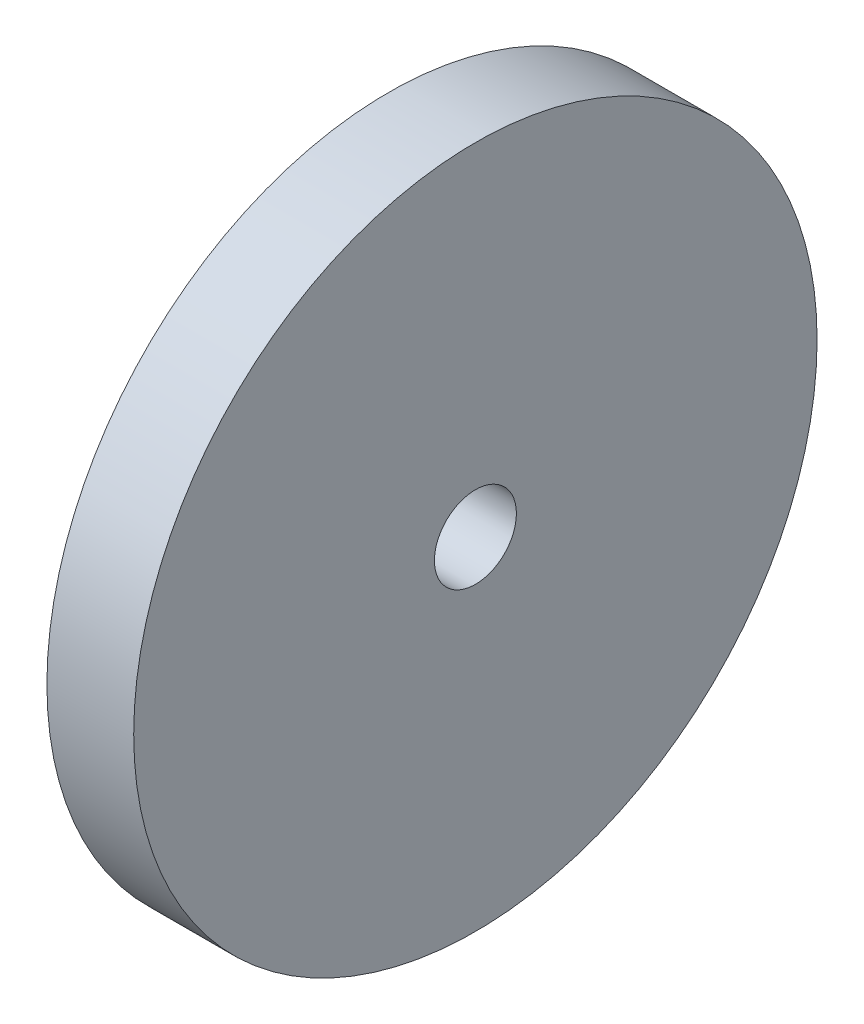
ISO-10303-21;
HEADER;
FILE_DESCRIPTION(('STEP AP214'),'2;1');
FILE_NAME('part.step','',(''),(''),'','','');
FILE_SCHEMA(('AUTOMOTIVE_DESIGN { 1 0 10303 214 1 1 1 1 }'));
ENDSEC;
DATA;
#1=APPLICATION_CONTEXT('core data for automotive mechanical design processes');
#2=APPLICATION_PROTOCOL_DEFINITION('international standard','automotive_design',2000,#1);
#3=PRODUCT_CONTEXT('',#1,'mechanical');
#4=PRODUCT('Part','Part','',(#3));
#5=PRODUCT_RELATED_PRODUCT_CATEGORY('part','',(#4));
#6=PRODUCT_DEFINITION_FORMATION('','',#4);
#7=PRODUCT_DEFINITION_CONTEXT('part definition',#1,'design');
#8=PRODUCT_DEFINITION('design','',#6,#7);
#9=PRODUCT_DEFINITION_SHAPE('','',#8);
#10=(LENGTH_UNIT() NAMED_UNIT(*) SI_UNIT(.MILLI.,.METRE.));
#11=(NAMED_UNIT(*) PLANE_ANGLE_UNIT() SI_UNIT($,.RADIAN.));
#12=(NAMED_UNIT(*) SI_UNIT($,.STERADIAN.) SOLID_ANGLE_UNIT());
#13=UNCERTAINTY_MEASURE_WITH_UNIT(LENGTH_MEASURE(1.E-05),#10,'distance_accuracy_value','');
#14=(GEOMETRIC_REPRESENTATION_CONTEXT(3) GLOBAL_UNCERTAINTY_ASSIGNED_CONTEXT((#13)) GLOBAL_UNIT_ASSIGNED_CONTEXT((#10,
#11,#12)) REPRESENTATION_CONTEXT('',''));
#15=CARTESIAN_POINT('',(0.,0.,0.));
#16=DIRECTION('',(0.,0.,1.));
#17=DIRECTION('',(1.,0.,0.));
#18=AXIS2_PLACEMENT_3D('',#15,#16,#17);
#19=CARTESIAN_POINT('',(12.7,0.,0.));
#20=DIRECTION('',(1.,0.,0.));
#21=DIRECTION('',(0.,0.,-1.));
#22=AXIS2_PLACEMENT_3D('',#19,#20,#21);
#23=PLANE('',#22);
#24=CARTESIAN_POINT('',(12.7,0.,0.));
#25=DIRECTION('',(1.,0.,0.));
#26=DIRECTION('',(0.,0.,-1.));
#27=AXIS2_PLACEMENT_3D('',#24,#25,#26);
#28=CIRCLE('',#27,50.);
#29=CARTESIAN_POINT('',(12.7,0.,-50.));
#30=VERTEX_POINT('',#29);
#31=EDGE_CURVE('E10',#30,#30,#28,.T.);
#32=ORIENTED_EDGE('',*,*,#31,.T.);
#33=EDGE_LOOP('',(#32));
#34=FACE_BOUND('',#33,.T.);
#35=CARTESIAN_POINT('',(12.7,0.,0.));
#36=DIRECTION('',(1.,0.,0.));
#37=DIRECTION('',(0.,0.,-1.));
#38=AXIS2_PLACEMENT_3D('',#35,#36,#37);
#39=CIRCLE('',#38,6.);
#40=CARTESIAN_POINT('',(12.7,0.,-6.));
#41=VERTEX_POINT('',#40);
#42=EDGE_CURVE('E41',#41,#41,#39,.T.);
#43=ORIENTED_EDGE('',*,*,#42,.F.);
#44=EDGE_LOOP('',(#43));
#45=FACE_BOUND('',#44,.T.);
#46=ADVANCED_FACE('F30',(#34,#45),#23,.T.);
#47=CARTESIAN_POINT('',(0.,0.,0.));
#48=DIRECTION('',(1.,0.,0.));
#49=DIRECTION('',(0.,0.,-1.));
#50=AXIS2_PLACEMENT_3D('',#47,#48,#49);
#51=PLANE('',#50);
#52=CARTESIAN_POINT('',(0.,0.,0.));
#53=DIRECTION('',(1.,0.,0.));
#54=DIRECTION('',(0.,0.,-1.));
#55=AXIS2_PLACEMENT_3D('',#52,#53,#54);
#56=CIRCLE('',#55,50.);
#57=CARTESIAN_POINT('',(0.,0.,-50.));
#58=VERTEX_POINT('',#57);
#59=EDGE_CURVE('E34',#58,#58,#56,.T.);
#60=ORIENTED_EDGE('',*,*,#59,.F.);
#61=EDGE_LOOP('',(#60));
#62=FACE_BOUND('',#61,.T.);
#63=CARTESIAN_POINT('',(0.,0.,0.));
#64=DIRECTION('',(1.,0.,0.));
#65=DIRECTION('',(0.,0.,-1.));
#66=AXIS2_PLACEMENT_3D('',#63,#64,#65);
#67=CIRCLE('',#66,6.);
#68=CARTESIAN_POINT('',(0.,0.,-6.));
#69=VERTEX_POINT('',#68);
#70=EDGE_CURVE('E43',#69,#69,#67,.T.);
#71=ORIENTED_EDGE('',*,*,#70,.T.);
#72=EDGE_LOOP('',(#71));
#73=FACE_BOUND('',#72,.T.);
#74=ADVANCED_FACE('F53',(#62,#73),#51,.F.);
#75=CARTESIAN_POINT('',(12.7,0.,0.));
#76=DIRECTION('',(-1.,0.,0.));
#77=DIRECTION('',(0.,0.,1.));
#78=AXIS2_PLACEMENT_3D('',#75,#76,#77);
#79=CYLINDRICAL_SURFACE('',#78,50.);
#80=ORIENTED_EDGE('',*,*,#31,.F.);
#81=EDGE_LOOP('',(#80));
#82=FACE_BOUND('',#81,.T.);
#83=ORIENTED_EDGE('',*,*,#59,.T.);
#84=EDGE_LOOP('',(#83));
#85=FACE_BOUND('',#84,.T.);
#86=ADVANCED_FACE('F32',(#82,#85),#79,.T.);
#87=CARTESIAN_POINT('',(12.7,0.,0.));
#88=DIRECTION('',(-1.,0.,0.));
#89=DIRECTION('',(0.,0.,1.));
#90=AXIS2_PLACEMENT_3D('',#87,#88,#89);
#91=CYLINDRICAL_SURFACE('',#90,6.);
#92=ORIENTED_EDGE('',*,*,#42,.T.);
#93=EDGE_LOOP('',(#92));
#94=FACE_BOUND('',#93,.T.);
#95=ORIENTED_EDGE('',*,*,#70,.F.);
#96=EDGE_LOOP('',(#95));
#97=FACE_BOUND('',#96,.T.);
#98=ADVANCED_FACE('F49',(#94,#97),#91,.F.);
#99=CLOSED_SHELL('',(#46,#74,#86,#98));
#100=MANIFOLD_SOLID_BREP('B2',#99);
#101=ADVANCED_BREP_SHAPE_REPRESENTATION('',(#18,#100),#14);
#102=SHAPE_DEFINITION_REPRESENTATION(#9,#101);
ENDSEC;
END-ISO-10303-21;
